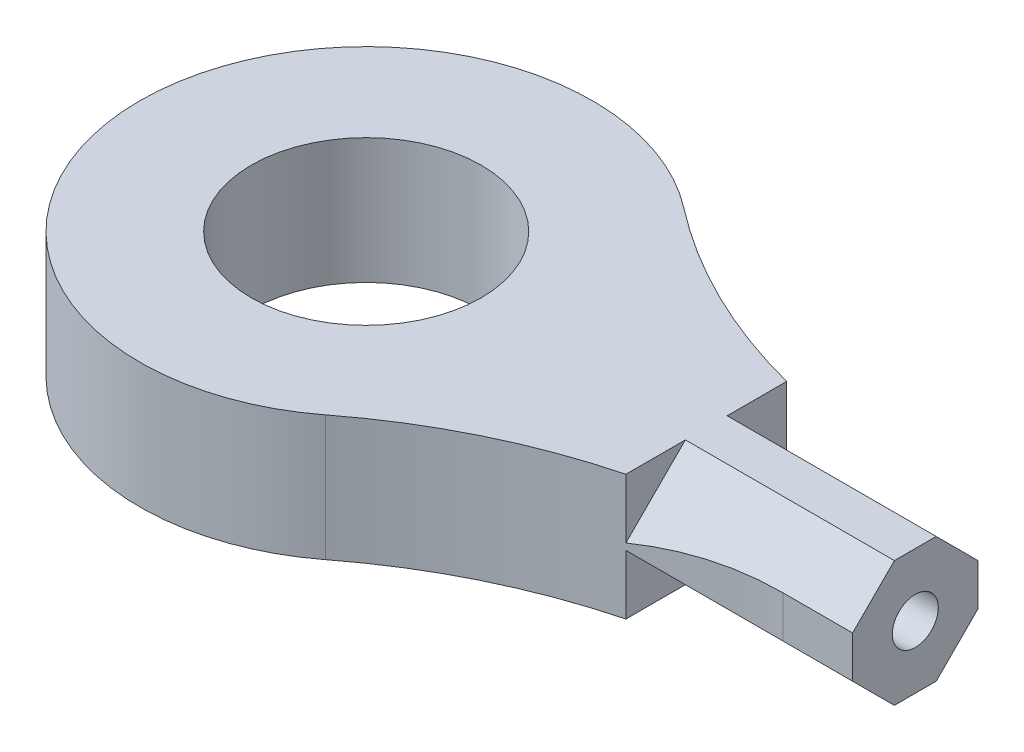
ISO-10303-21;
HEADER;
FILE_DESCRIPTION(('STEP AP214'),'2;1');
FILE_NAME('part.step','',(''),(''),'','','');
FILE_SCHEMA(('AUTOMOTIVE_DESIGN { 1 0 10303 214 1 1 1 1 }'));
ENDSEC;
DATA;
#1=APPLICATION_CONTEXT('core data for automotive mechanical design processes');
#2=APPLICATION_PROTOCOL_DEFINITION('international standard','automotive_design',2000,#1);
#3=PRODUCT_CONTEXT('',#1,'mechanical');
#4=PRODUCT('Part','Part','',(#3));
#5=PRODUCT_RELATED_PRODUCT_CATEGORY('part','',(#4));
#6=PRODUCT_DEFINITION_FORMATION('','',#4);
#7=PRODUCT_DEFINITION_CONTEXT('part definition',#1,'design');
#8=PRODUCT_DEFINITION('design','',#6,#7);
#9=PRODUCT_DEFINITION_SHAPE('','',#8);
#10=(LENGTH_UNIT() NAMED_UNIT(*) SI_UNIT(.MILLI.,.METRE.));
#11=(NAMED_UNIT(*) PLANE_ANGLE_UNIT() SI_UNIT($,.RADIAN.));
#12=(NAMED_UNIT(*) SI_UNIT($,.STERADIAN.) SOLID_ANGLE_UNIT());
#13=UNCERTAINTY_MEASURE_WITH_UNIT(LENGTH_MEASURE(1.E-05),#10,'distance_accuracy_value','');
#14=(GEOMETRIC_REPRESENTATION_CONTEXT(3) GLOBAL_UNCERTAINTY_ASSIGNED_CONTEXT((#13)) GLOBAL_UNIT_ASSIGNED_CONTEXT((#10,
#11,#12)) REPRESENTATION_CONTEXT('',''));
#15=CARTESIAN_POINT('',(0.,0.,0.));
#16=DIRECTION('',(0.,0.,1.));
#17=DIRECTION('',(1.,0.,0.));
#18=AXIS2_PLACEMENT_3D('',#15,#16,#17);
#19=CARTESIAN_POINT('',(34.4065764062628,9.,-44.5));
#20=DIRECTION('',(0.,1.,0.));
#21=DIRECTION('',(0.,0.,1.));
#22=AXIS2_PLACEMENT_3D('',#19,#20,#21);
#23=PLANE('',#22);
#24=DIRECTION('',(1.,0.,0.));
#25=VECTOR('',#24,1.);
#26=CARTESIAN_POINT('',(34.4065764062628,9.,-1.5));
#27=LINE('',#26,#25);
#28=CARTESIAN_POINT('',(24.4065764062628,9.,-1.5));
#29=VERTEX_POINT('',#28);
#30=CARTESIAN_POINT('',(39.4065764062628,9.,-1.5));
#31=VERTEX_POINT('',#30);
#32=EDGE_CURVE('E221',#29,#31,#27,.T.);
#33=ORIENTED_EDGE('',*,*,#32,.F.);
#34=DIRECTION('',(0.,0.,-1.));
#35=VECTOR('',#34,1.);
#36=CARTESIAN_POINT('',(24.4065764062628,9.,-44.5));
#37=LINE('',#36,#35);
#38=CARTESIAN_POINT('',(24.4065764062628,9.,-5.77016653792583));
#39=VERTEX_POINT('',#38);
#40=EDGE_CURVE('E209',#29,#39,#37,.T.);
#41=ORIENTED_EDGE('',*,*,#40,.T.);
#42=CARTESIAN_POINT('',(34.4065764062628,9.,-44.5));
#43=DIRECTION('',(0.,-1.,0.));
#44=DIRECTION('',(0.,0.,1.));
#45=AXIS2_PLACEMENT_3D('',#42,#43,#44);
#46=CIRCLE('',#45,40.);
#47=CARTESIAN_POINT('',(9.93967762847592,9.,-12.8555555555556));
#48=VERTEX_POINT('',#47);
#49=EDGE_CURVE('E218',#39,#48,#46,.T.);
#50=ORIENTED_EDGE('',*,*,#49,.T.);
#51=CARTESIAN_POINT('',(0.,9.,0.));
#52=DIRECTION('',(0.,1.,0.));
#53=DIRECTION('',(0.,0.,1.));
#54=AXIS2_PLACEMENT_3D('',#51,#52,#53);
#55=CIRCLE('',#54,16.25);
#56=CARTESIAN_POINT('',(9.93967762847592,9.,12.8555555555556));
#57=VERTEX_POINT('',#56);
#58=EDGE_CURVE('E225',#48,#57,#55,.T.);
#59=ORIENTED_EDGE('',*,*,#58,.T.);
#60=CARTESIAN_POINT('',(34.4065764062628,9.,44.5));
#61=DIRECTION('',(0.,-1.,0.));
#62=DIRECTION('',(0.,0.,-1.));
#63=AXIS2_PLACEMENT_3D('',#60,#61,#62);
#64=CIRCLE('',#63,40.);
#65=CARTESIAN_POINT('',(24.4065764062628,9.,5.77016653792583));
#66=VERTEX_POINT('',#65);
#67=EDGE_CURVE('E228',#57,#66,#64,.T.);
#68=ORIENTED_EDGE('',*,*,#67,.T.);
#69=DIRECTION('',(0.,0.,-1.));
#70=VECTOR('',#69,1.);
#71=CARTESIAN_POINT('',(24.4065764062628,9.,-44.5));
#72=LINE('',#71,#70);
#73=CARTESIAN_POINT('',(24.4065764062628,9.,1.5));
#74=VERTEX_POINT('',#73);
#75=EDGE_CURVE('E280',#66,#74,#72,.T.);
#76=ORIENTED_EDGE('',*,*,#75,.T.);
#77=DIRECTION('',(1.,0.,0.));
#78=VECTOR('',#77,1.);
#79=CARTESIAN_POINT('',(34.4065764062628,9.,1.49999999999999));
#80=LINE('',#79,#78);
#81=CARTESIAN_POINT('',(39.4065764062628,9.,1.5));
#82=VERTEX_POINT('',#81);
#83=EDGE_CURVE('E277',#74,#82,#80,.T.);
#84=ORIENTED_EDGE('',*,*,#83,.T.);
#85=DIRECTION('',(0.,0.,-1.));
#86=VECTOR('',#85,1.);
#87=CARTESIAN_POINT('',(39.4065764062628,9.,-4.5));
#88=LINE('',#87,#86);
#89=EDGE_CURVE('E238',#82,#31,#88,.T.);
#90=ORIENTED_EDGE('',*,*,#89,.T.);
#91=EDGE_LOOP('',(#33,#41,#50,#59,#68,#76,#84,#90));
#92=FACE_BOUND('',#91,.T.);
#93=CARTESIAN_POINT('',(0.,9.,0.));
#94=DIRECTION('',(0.,1.,0.));
#95=DIRECTION('',(0.,0.,1.));
#96=AXIS2_PLACEMENT_3D('',#93,#94,#95);
#97=CIRCLE('',#96,8.25);
#98=CARTESIAN_POINT('',(0.,9.,8.25));
#99=VERTEX_POINT('',#98);
#100=EDGE_CURVE('E243',#99,#99,#97,.T.);
#101=ORIENTED_EDGE('',*,*,#100,.F.);
#102=EDGE_LOOP('',(#101));
#103=FACE_BOUND('',#102,.T.);
#104=ADVANCED_FACE('F57',(#92,#103),#23,.T.);
#105=CARTESIAN_POINT('',(34.4065764062628,0.,-44.5));
#106=DIRECTION('',(0.,1.,0.));
#107=DIRECTION('',(0.,0.,1.));
#108=AXIS2_PLACEMENT_3D('',#105,#106,#107);
#109=PLANE('',#108);
#110=CARTESIAN_POINT('',(0.,0.,0.));
#111=DIRECTION('',(0.,1.,0.));
#112=DIRECTION('',(0.,0.,1.));
#113=AXIS2_PLACEMENT_3D('',#110,#111,#112);
#114=CIRCLE('',#113,8.25);
#115=CARTESIAN_POINT('',(0.,0.,8.25));
#116=VERTEX_POINT('',#115);
#117=EDGE_CURVE('E233',#116,#116,#114,.T.);
#118=ORIENTED_EDGE('',*,*,#117,.T.);
#119=EDGE_LOOP('',(#118));
#120=FACE_BOUND('',#119,.T.);
#121=DIRECTION('',(0.,0.,-1.));
#122=VECTOR('',#121,1.);
#123=CARTESIAN_POINT('',(39.4065764062628,0.,-4.5));
#124=LINE('',#123,#122);
#125=CARTESIAN_POINT('',(39.4065764062628,0.,1.5));
#126=VERTEX_POINT('',#125);
#127=CARTESIAN_POINT('',(39.4065764062628,0.,-1.5));
#128=VERTEX_POINT('',#127);
#129=EDGE_CURVE('E226',#126,#128,#124,.T.);
#130=ORIENTED_EDGE('',*,*,#129,.F.);
#131=DIRECTION('',(-1.,0.,0.));
#132=VECTOR('',#131,1.);
#133=CARTESIAN_POINT('',(34.4065764062628,0.,1.5));
#134=LINE('',#133,#132);
#135=CARTESIAN_POINT('',(24.4065764062628,0.,1.5));
#136=VERTEX_POINT('',#135);
#137=EDGE_CURVE('E72',#126,#136,#134,.T.);
#138=ORIENTED_EDGE('',*,*,#137,.T.);
#139=DIRECTION('',(0.,0.,-1.));
#140=VECTOR('',#139,1.);
#141=CARTESIAN_POINT('',(24.4065764062628,0.,-44.5));
#142=LINE('',#141,#140);
#143=CARTESIAN_POINT('',(24.4065764062628,0.,5.77016653792583));
#144=VERTEX_POINT('',#143);
#145=EDGE_CURVE('E338',#144,#136,#142,.T.);
#146=ORIENTED_EDGE('',*,*,#145,.F.);
#147=CARTESIAN_POINT('',(34.4065764062628,0.,44.5));
#148=DIRECTION('',(0.,-1.,0.));
#149=DIRECTION('',(0.,0.,-1.));
#150=AXIS2_PLACEMENT_3D('',#147,#148,#149);
#151=CIRCLE('',#150,40.);
#152=CARTESIAN_POINT('',(9.93967762847592,0.,12.8555555555556));
#153=VERTEX_POINT('',#152);
#154=EDGE_CURVE('E230',#153,#144,#151,.T.);
#155=ORIENTED_EDGE('',*,*,#154,.F.);
#156=CARTESIAN_POINT('',(0.,0.,0.));
#157=DIRECTION('',(0.,1.,0.));
#158=DIRECTION('',(0.,0.,1.));
#159=AXIS2_PLACEMENT_3D('',#156,#157,#158);
#160=CIRCLE('',#159,16.25);
#161=CARTESIAN_POINT('',(9.93967762847592,0.,-12.8555555555556));
#162=VERTEX_POINT('',#161);
#163=EDGE_CURVE('E242',#162,#153,#160,.T.);
#164=ORIENTED_EDGE('',*,*,#163,.F.);
#165=CARTESIAN_POINT('',(34.4065764062628,0.,-44.5));
#166=DIRECTION('',(0.,-1.,0.));
#167=DIRECTION('',(0.,0.,1.));
#168=AXIS2_PLACEMENT_3D('',#165,#166,#167);
#169=CIRCLE('',#168,40.);
#170=CARTESIAN_POINT('',(24.4065764062628,0.,-5.77016653792583));
#171=VERTEX_POINT('',#170);
#172=EDGE_CURVE('E240',#171,#162,#169,.T.);
#173=ORIENTED_EDGE('',*,*,#172,.F.);
#174=DIRECTION('',(0.,0.,-1.));
#175=VECTOR('',#174,1.);
#176=CARTESIAN_POINT('',(24.4065764062628,0.,-44.5));
#177=LINE('',#176,#175);
#178=CARTESIAN_POINT('',(24.4065764062628,0.,-1.5));
#179=VERTEX_POINT('',#178);
#180=EDGE_CURVE('E283',#179,#171,#177,.T.);
#181=ORIENTED_EDGE('',*,*,#180,.F.);
#182=DIRECTION('',(-1.,0.,0.));
#183=VECTOR('',#182,1.);
#184=CARTESIAN_POINT('',(34.4065764062628,0.,-1.5));
#185=LINE('',#184,#183);
#186=EDGE_CURVE('E261',#128,#179,#185,.T.);
#187=ORIENTED_EDGE('',*,*,#186,.F.);
#188=EDGE_LOOP('',(#130,#138,#146,#155,#164,#173,#181,#187));
#189=FACE_BOUND('',#188,.T.);
#190=ADVANCED_FACE('F296',(#120,#189),#109,.F.);
#191=CARTESIAN_POINT('',(34.4065764062628,9.,-44.5));
#192=DIRECTION('',(0.,-1.,0.));
#193=DIRECTION('',(0.,0.,-1.));
#194=AXIS2_PLACEMENT_3D('',#191,#192,#193);
#195=CYLINDRICAL_SURFACE('',#194,40.);
#196=DIRECTION('',(0.,-1.,0.));
#197=VECTOR('',#196,1.);
#198=CARTESIAN_POINT('',(24.4065764062628,9.,-5.77016653792583));
#199=LINE('',#198,#197);
#200=CARTESIAN_POINT('',(24.4065764062628,4.72983346207417,-5.77016653792583));
#201=VERTEX_POINT('',#200);
#202=EDGE_CURVE('E165',#201,#39,#199,.F.);
#203=ORIENTED_EDGE('',*,*,#202,.F.);
#204=CARTESIAN_POINT('',(34.4065764062628,-34.,-44.5));
#205=DIRECTION('',(0.,-0.707106781186548,0.707106781186547));
#206=DIRECTION('',(0.,-0.707106781186547,-0.707106781186548));
#207=AXIS2_PLACEMENT_3D('',#204,#205,#206);
#208=ELLIPSE('',#207,56.5685424949238,40.);
#209=CARTESIAN_POINT('',(34.4065764062628,6.,-4.5));
#210=VERTEX_POINT('',#209);
#211=EDGE_CURVE('E251',#201,#210,#208,.F.);
#212=ORIENTED_EDGE('',*,*,#211,.T.);
#213=DIRECTION('',(0.,-1.,0.));
#214=VECTOR('',#213,1.);
#215=CARTESIAN_POINT('',(34.4065764062628,9.,-4.5));
#216=LINE('',#215,#214);
#217=CARTESIAN_POINT('',(34.4065764062628,3.,-4.5));
#218=VERTEX_POINT('',#217);
#219=EDGE_CURVE('E185',#210,#218,#216,.T.);
#220=ORIENTED_EDGE('',*,*,#219,.T.);
#221=CARTESIAN_POINT('',(34.4065764062628,43.,-44.5));
#222=DIRECTION('',(0.,-0.707106781186547,-0.707106781186547));
#223=DIRECTION('',(0.,-0.707106781186548,0.707106781186548));
#224=AXIS2_PLACEMENT_3D('',#221,#222,#223);
#225=ELLIPSE('',#224,56.5685424949238,40.);
#226=CARTESIAN_POINT('',(24.4065764062628,4.27016653792583,-5.77016653792583));
#227=VERTEX_POINT('',#226);
#228=EDGE_CURVE('E250',#227,#218,#225,.F.);
#229=ORIENTED_EDGE('',*,*,#228,.F.);
#230=DIRECTION('',(0.,-1.,0.));
#231=VECTOR('',#230,1.);
#232=CARTESIAN_POINT('',(24.4065764062628,9.,-5.77016653792583));
#233=LINE('',#232,#231);
#234=EDGE_CURVE('E200',#171,#227,#233,.F.);
#235=ORIENTED_EDGE('',*,*,#234,.F.);
#236=ORIENTED_EDGE('',*,*,#172,.T.);
#237=DIRECTION('',(0.,-1.,0.));
#238=VECTOR('',#237,1.);
#239=CARTESIAN_POINT('',(9.93967762847592,9.,-12.8555555555556));
#240=LINE('',#239,#238);
#241=EDGE_CURVE('E191',#48,#162,#240,.T.);
#242=ORIENTED_EDGE('',*,*,#241,.F.);
#243=ORIENTED_EDGE('',*,*,#49,.F.);
#244=EDGE_LOOP('',(#203,#212,#220,#229,#235,#236,#242,#243));
#245=FACE_BOUND('',#244,.T.);
#246=ADVANCED_FACE('F59',(#245),#195,.F.);
#247=CARTESIAN_POINT('',(34.4065764062628,9.,44.5));
#248=DIRECTION('',(0.,-1.,0.));
#249=DIRECTION('',(0.,0.,-1.));
#250=AXIS2_PLACEMENT_3D('',#247,#248,#249);
#251=CYLINDRICAL_SURFACE('',#250,40.);
#252=DIRECTION('',(0.,-1.,0.));
#253=VECTOR('',#252,1.);
#254=CARTESIAN_POINT('',(24.4065764062628,9.,5.77016653792583));
#255=LINE('',#254,#253);
#256=CARTESIAN_POINT('',(24.4065764062628,4.27016653792583,5.77016653792583));
#257=VERTEX_POINT('',#256);
#258=EDGE_CURVE('E12',#257,#144,#255,.T.);
#259=ORIENTED_EDGE('',*,*,#258,.F.);
#260=CARTESIAN_POINT('',(34.4065764062628,43.,44.5));
#261=DIRECTION('',(0.,0.707106781186547,-0.707106781186547));
#262=DIRECTION('',(0.,-0.707106781186548,-0.707106781186548));
#263=AXIS2_PLACEMENT_3D('',#260,#261,#262);
#264=ELLIPSE('',#263,56.5685424949238,40.);
#265=CARTESIAN_POINT('',(34.4065764062628,3.,4.5));
#266=VERTEX_POINT('',#265);
#267=EDGE_CURVE('E174',#257,#266,#264,.F.);
#268=ORIENTED_EDGE('',*,*,#267,.T.);
#269=DIRECTION('',(0.,-1.,0.));
#270=VECTOR('',#269,1.);
#271=CARTESIAN_POINT('',(34.4065764062628,9.,4.5));
#272=LINE('',#271,#270);
#273=CARTESIAN_POINT('',(34.4065764062628,6.,4.5));
#274=VERTEX_POINT('',#273);
#275=EDGE_CURVE('E173',#274,#266,#272,.T.);
#276=ORIENTED_EDGE('',*,*,#275,.F.);
#277=CARTESIAN_POINT('',(34.4065764062628,-34.,44.5));
#278=DIRECTION('',(0.,0.707106781186548,0.707106781186547));
#279=DIRECTION('',(0.,-0.707106781186547,0.707106781186548));
#280=AXIS2_PLACEMENT_3D('',#277,#278,#279);
#281=ELLIPSE('',#280,56.5685424949238,40.);
#282=CARTESIAN_POINT('',(24.4065764062628,4.72983346207417,5.77016653792583));
#283=VERTEX_POINT('',#282);
#284=EDGE_CURVE('E275',#283,#274,#281,.F.);
#285=ORIENTED_EDGE('',*,*,#284,.F.);
#286=DIRECTION('',(0.,-1.,0.));
#287=VECTOR('',#286,1.);
#288=CARTESIAN_POINT('',(24.4065764062628,9.,5.77016653792583));
#289=LINE('',#288,#287);
#290=EDGE_CURVE('E198',#66,#283,#289,.T.);
#291=ORIENTED_EDGE('',*,*,#290,.F.);
#292=ORIENTED_EDGE('',*,*,#67,.F.);
#293=DIRECTION('',(0.,-1.,0.));
#294=VECTOR('',#293,1.);
#295=CARTESIAN_POINT('',(9.93967762847592,9.,12.8555555555556));
#296=LINE('',#295,#294);
#297=EDGE_CURVE('E183',#57,#153,#296,.T.);
#298=ORIENTED_EDGE('',*,*,#297,.T.);
#299=ORIENTED_EDGE('',*,*,#154,.T.);
#300=EDGE_LOOP('',(#259,#268,#276,#285,#291,#292,#298,#299));
#301=FACE_BOUND('',#300,.T.);
#302=ADVANCED_FACE('F326',(#301),#251,.F.);
#303=CARTESIAN_POINT('',(39.4065764062628,9.,4.5));
#304=DIRECTION('',(0.,0.,-1.));
#305=DIRECTION('',(-1.,0.,0.));
#306=AXIS2_PLACEMENT_3D('',#303,#304,#305);
#307=PLANE('',#306);
#308=ORIENTED_EDGE('',*,*,#275,.T.);
#309=DIRECTION('',(1.,0.,0.));
#310=VECTOR('',#309,1.);
#311=CARTESIAN_POINT('',(39.4065764062628,3.,4.5));
#312=LINE('',#311,#310);
#313=CARTESIAN_POINT('',(39.4065764062628,3.,4.5));
#314=VERTEX_POINT('',#313);
#315=EDGE_CURVE('E160',#266,#314,#312,.T.);
#316=ORIENTED_EDGE('',*,*,#315,.T.);
#317=DIRECTION('',(0.,-1.,0.));
#318=VECTOR('',#317,1.);
#319=CARTESIAN_POINT('',(39.4065764062628,9.,4.5));
#320=LINE('',#319,#318);
#321=CARTESIAN_POINT('',(39.4065764062628,6.,4.5));
#322=VERTEX_POINT('',#321);
#323=EDGE_CURVE('E171',#322,#314,#320,.T.);
#324=ORIENTED_EDGE('',*,*,#323,.F.);
#325=DIRECTION('',(1.,0.,0.));
#326=VECTOR('',#325,1.);
#327=CARTESIAN_POINT('',(39.4065764062628,6.,4.5));
#328=LINE('',#327,#326);
#329=EDGE_CURVE('E273',#274,#322,#328,.T.);
#330=ORIENTED_EDGE('',*,*,#329,.F.);
#331=EDGE_LOOP('',(#308,#316,#324,#330));
#332=FACE_BOUND('',#331,.T.);
#333=ADVANCED_FACE('F169',(#332),#307,.F.);
#334=CARTESIAN_POINT('',(39.4065764062628,9.,-4.5));
#335=DIRECTION('',(-1.,0.,0.));
#336=DIRECTION('',(0.,0.,1.));
#337=AXIS2_PLACEMENT_3D('',#334,#335,#336);
#338=PLANE('',#337);
#339=CARTESIAN_POINT('',(39.4065764062628,4.5,0.));
#340=DIRECTION('',(1.,0.,0.));
#341=DIRECTION('',(0.,0.,-1.));
#342=AXIS2_PLACEMENT_3D('',#339,#340,#341);
#343=CIRCLE('',#342,1.65);
#344=CARTESIAN_POINT('',(39.4065764062628,4.5,-1.65));
#345=VERTEX_POINT('',#344);
#346=EDGE_CURVE('E285',#345,#345,#343,.T.);
#347=ORIENTED_EDGE('',*,*,#346,.F.);
#348=EDGE_LOOP('',(#347));
#349=FACE_BOUND('',#348,.T.);
#350=ORIENTED_EDGE('',*,*,#323,.T.);
#351=DIRECTION('',(0.,-0.707106781186548,-0.707106781186548));
#352=VECTOR('',#351,1.);
#353=CARTESIAN_POINT('',(39.4065764062628,1.5,3.));
#354=LINE('',#353,#352);
#355=EDGE_CURVE('E65',#314,#126,#354,.T.);
#356=ORIENTED_EDGE('',*,*,#355,.T.);
#357=ORIENTED_EDGE('',*,*,#129,.T.);
#358=DIRECTION('',(0.,0.707106781186548,-0.707106781186548));
#359=VECTOR('',#358,1.);
#360=CARTESIAN_POINT('',(39.4065764062628,-0.75,-0.75));
#361=LINE('',#360,#359);
#362=CARTESIAN_POINT('',(39.4065764062628,3.,-4.5));
#363=VERTEX_POINT('',#362);
#364=EDGE_CURVE('E222',#128,#363,#361,.T.);
#365=ORIENTED_EDGE('',*,*,#364,.T.);
#366=DIRECTION('',(0.,-1.,0.));
#367=VECTOR('',#366,1.);
#368=CARTESIAN_POINT('',(39.4065764062628,9.,-4.5));
#369=LINE('',#368,#367);
#370=CARTESIAN_POINT('',(39.4065764062628,6.,-4.5));
#371=VERTEX_POINT('',#370);
#372=EDGE_CURVE('E181',#371,#363,#369,.T.);
#373=ORIENTED_EDGE('',*,*,#372,.F.);
#374=DIRECTION('',(0.,-0.707106781186547,-0.707106781186548));
#375=VECTOR('',#374,1.);
#376=CARTESIAN_POINT('',(39.4065764062628,5.25,-5.25));
#377=LINE('',#376,#375);
#378=EDGE_CURVE('E80',#31,#371,#377,.T.);
#379=ORIENTED_EDGE('',*,*,#378,.F.);
#380=ORIENTED_EDGE('',*,*,#89,.F.);
#381=DIRECTION('',(0.,0.707106781186547,-0.707106781186548));
#382=VECTOR('',#381,1.);
#383=CARTESIAN_POINT('',(39.4065764062628,12.,-1.5));
#384=LINE('',#383,#382);
#385=EDGE_CURVE('E180',#322,#82,#384,.T.);
#386=ORIENTED_EDGE('',*,*,#385,.F.);
#387=EDGE_LOOP('',(#350,#356,#357,#365,#373,#379,#380,#386));
#388=FACE_BOUND('',#387,.T.);
#389=ADVANCED_FACE('F178',(#349,#388),#338,.F.);
#390=CARTESIAN_POINT('',(39.4065764062628,9.,-4.5));
#391=DIRECTION('',(0.,0.,1.));
#392=DIRECTION('',(1.,0.,0.));
#393=AXIS2_PLACEMENT_3D('',#390,#391,#392);
#394=PLANE('',#393);
#395=ORIENTED_EDGE('',*,*,#219,.F.);
#396=DIRECTION('',(1.,0.,0.));
#397=VECTOR('',#396,1.);
#398=CARTESIAN_POINT('',(39.4065764062628,6.,-4.5));
#399=LINE('',#398,#397);
#400=EDGE_CURVE('E202',#210,#371,#399,.T.);
#401=ORIENTED_EDGE('',*,*,#400,.T.);
#402=ORIENTED_EDGE('',*,*,#372,.T.);
#403=DIRECTION('',(1.,0.,0.));
#404=VECTOR('',#403,1.);
#405=CARTESIAN_POINT('',(39.4065764062628,3.,-4.5));
#406=LINE('',#405,#404);
#407=EDGE_CURVE('E194',#218,#363,#406,.T.);
#408=ORIENTED_EDGE('',*,*,#407,.F.);
#409=EDGE_LOOP('',(#395,#401,#402,#408));
#410=FACE_BOUND('',#409,.T.);
#411=ADVANCED_FACE('F264',(#410),#394,.F.);
#412=CARTESIAN_POINT('',(0.,9.,0.));
#413=DIRECTION('',(0.,-1.,0.));
#414=DIRECTION('',(0.,0.,-1.));
#415=AXIS2_PLACEMENT_3D('',#412,#413,#414);
#416=CYLINDRICAL_SURFACE('',#415,16.25);
#417=ORIENTED_EDGE('',*,*,#163,.T.);
#418=ORIENTED_EDGE('',*,*,#297,.F.);
#419=ORIENTED_EDGE('',*,*,#58,.F.);
#420=ORIENTED_EDGE('',*,*,#241,.T.);
#421=EDGE_LOOP('',(#417,#418,#419,#420));
#422=FACE_BOUND('',#421,.T.);
#423=ADVANCED_FACE('F302',(#422),#416,.T.);
#424=CARTESIAN_POINT('',(0.,9.,0.));
#425=DIRECTION('',(0.,-1.,0.));
#426=DIRECTION('',(0.,0.,-1.));
#427=AXIS2_PLACEMENT_3D('',#424,#425,#426);
#428=CYLINDRICAL_SURFACE('',#427,8.25);
#429=ORIENTED_EDGE('',*,*,#100,.T.);
#430=EDGE_LOOP('',(#429));
#431=FACE_BOUND('',#430,.T.);
#432=ORIENTED_EDGE('',*,*,#117,.F.);
#433=EDGE_LOOP('',(#432));
#434=FACE_BOUND('',#433,.T.);
#435=ADVANCED_FACE('F299',(#431,#434),#428,.F.);
#436=CARTESIAN_POINT('',(28.4065764062628,4.5,0.));
#437=DIRECTION('',(1.,0.,0.));
#438=DIRECTION('',(0.,0.,-1.));
#439=AXIS2_PLACEMENT_3D('',#436,#437,#438);
#440=CONICAL_SURFACE('',#439,1.65,1.02974425867665);
#441=CARTESIAN_POINT('',(27.4151563848673,4.5,0.));
#442=VERTEX_POINT('',#441);
#443=VERTEX_LOOP('',#442);
#444=FACE_BOUND('',#443,.T.);
#445=CARTESIAN_POINT('',(28.4065764062628,4.5,0.));
#446=DIRECTION('',(1.,0.,0.));
#447=DIRECTION('',(0.,0.,-1.));
#448=AXIS2_PLACEMENT_3D('',#445,#446,#447);
#449=CIRCLE('',#448,1.65);
#450=CARTESIAN_POINT('',(28.4065764062628,4.5,-1.65));
#451=VERTEX_POINT('',#450);
#452=EDGE_CURVE('E288',#451,#451,#449,.T.);
#453=ORIENTED_EDGE('',*,*,#452,.T.);
#454=EDGE_LOOP('',(#453));
#455=FACE_BOUND('',#454,.T.);
#456=ADVANCED_FACE('F301',(#444,#455),#440,.F.);
#457=CARTESIAN_POINT('',(39.4065764062628,4.5,0.));
#458=DIRECTION('',(1.,0.,0.));
#459=DIRECTION('',(0.,0.,-1.));
#460=AXIS2_PLACEMENT_3D('',#457,#458,#459);
#461=CYLINDRICAL_SURFACE('',#460,1.65);
#462=ORIENTED_EDGE('',*,*,#452,.F.);
#463=EDGE_LOOP('',(#462));
#464=FACE_BOUND('',#463,.T.);
#465=ORIENTED_EDGE('',*,*,#346,.T.);
#466=EDGE_LOOP('',(#465));
#467=FACE_BOUND('',#466,.T.);
#468=ADVANCED_FACE('F308',(#464,#467),#461,.F.);
#469=CARTESIAN_POINT('',(24.4065764062628,0.,0.));
#470=DIRECTION('',(1.,0.,0.));
#471=DIRECTION('',(0.,0.,-1.));
#472=AXIS2_PLACEMENT_3D('',#469,#470,#471);
#473=PLANE('',#472);
#474=ORIENTED_EDGE('',*,*,#180,.T.);
#475=ORIENTED_EDGE('',*,*,#234,.T.);
#476=DIRECTION('',(0.,0.707106781186548,-0.707106781186548));
#477=VECTOR('',#476,1.);
#478=CARTESIAN_POINT('',(24.4065764062628,-0.75,-0.75));
#479=LINE('',#478,#477);
#480=EDGE_CURVE('E260',#179,#227,#479,.T.);
#481=ORIENTED_EDGE('',*,*,#480,.F.);
#482=EDGE_LOOP('',(#474,#475,#481));
#483=FACE_BOUND('',#482,.T.);
#484=ADVANCED_FACE('F361',(#483),#473,.T.);
#485=CARTESIAN_POINT('',(24.4065764062628,-0.75,-0.75));
#486=DIRECTION('',(0.,-0.707106781186547,-0.707106781186547));
#487=DIRECTION('',(0.,0.707106781186548,-0.707106781186548));
#488=AXIS2_PLACEMENT_3D('',#485,#486,#487);
#489=PLANE('',#488);
#490=ORIENTED_EDGE('',*,*,#186,.T.);
#491=ORIENTED_EDGE('',*,*,#480,.T.);
#492=ORIENTED_EDGE('',*,*,#228,.T.);
#493=ORIENTED_EDGE('',*,*,#407,.T.);
#494=ORIENTED_EDGE('',*,*,#364,.F.);
#495=EDGE_LOOP('',(#490,#491,#492,#493,#494));
#496=FACE_BOUND('',#495,.T.);
#497=ADVANCED_FACE('F256',(#496),#489,.T.);
#498=CARTESIAN_POINT('',(24.4065764062628,5.25,5.25));
#499=DIRECTION('',(0.,0.707106781186548,0.707106781186547));
#500=DIRECTION('',(0.,-0.707106781186547,0.707106781186548));
#501=AXIS2_PLACEMENT_3D('',#498,#499,#500);
#502=PLANE('',#501);
#503=DIRECTION('',(0.,-0.707106781186547,0.707106781186548));
#504=VECTOR('',#503,1.);
#505=CARTESIAN_POINT('',(24.4065764062628,5.25,5.25));
#506=LINE('',#505,#504);
#507=EDGE_CURVE('E262',#74,#283,#506,.T.);
#508=ORIENTED_EDGE('',*,*,#507,.T.);
#509=ORIENTED_EDGE('',*,*,#284,.T.);
#510=ORIENTED_EDGE('',*,*,#329,.T.);
#511=ORIENTED_EDGE('',*,*,#385,.T.);
#512=ORIENTED_EDGE('',*,*,#83,.F.);
#513=EDGE_LOOP('',(#508,#509,#510,#511,#512));
#514=FACE_BOUND('',#513,.T.);
#515=ADVANCED_FACE('F356',(#514),#502,.T.);
#516=CARTESIAN_POINT('',(24.4065764062628,0.,0.));
#517=DIRECTION('',(1.,0.,0.));
#518=DIRECTION('',(0.,0.,-1.));
#519=AXIS2_PLACEMENT_3D('',#516,#517,#518);
#520=PLANE('',#519);
#521=ORIENTED_EDGE('',*,*,#290,.T.);
#522=ORIENTED_EDGE('',*,*,#507,.F.);
#523=ORIENTED_EDGE('',*,*,#75,.F.);
#524=EDGE_LOOP('',(#521,#522,#523));
#525=FACE_BOUND('',#524,.T.);
#526=ADVANCED_FACE('F349',(#525),#520,.T.);
#527=CARTESIAN_POINT('',(24.4065764062628,5.25,-5.25));
#528=DIRECTION('',(0.,-0.707106781186548,0.707106781186547));
#529=DIRECTION('',(0.,-0.707106781186547,-0.707106781186548));
#530=AXIS2_PLACEMENT_3D('',#527,#528,#529);
#531=PLANE('',#530);
#532=ORIENTED_EDGE('',*,*,#32,.T.);
#533=ORIENTED_EDGE('',*,*,#378,.T.);
#534=ORIENTED_EDGE('',*,*,#400,.F.);
#535=ORIENTED_EDGE('',*,*,#211,.F.);
#536=DIRECTION('',(0.,-0.707106781186547,-0.707106781186548));
#537=VECTOR('',#536,1.);
#538=CARTESIAN_POINT('',(24.4065764062628,5.25,-5.25));
#539=LINE('',#538,#537);
#540=EDGE_CURVE('E211',#29,#201,#539,.T.);
#541=ORIENTED_EDGE('',*,*,#540,.F.);
#542=EDGE_LOOP('',(#532,#533,#534,#535,#541));
#543=FACE_BOUND('',#542,.T.);
#544=ADVANCED_FACE('F347',(#543),#531,.F.);
#545=CARTESIAN_POINT('',(24.4065764062628,0.,0.));
#546=DIRECTION('',(1.,0.,0.));
#547=DIRECTION('',(0.,0.,-1.));
#548=AXIS2_PLACEMENT_3D('',#545,#546,#547);
#549=PLANE('',#548);
#550=ORIENTED_EDGE('',*,*,#540,.T.);
#551=ORIENTED_EDGE('',*,*,#202,.T.);
#552=ORIENTED_EDGE('',*,*,#40,.F.);
#553=EDGE_LOOP('',(#550,#551,#552));
#554=FACE_BOUND('',#553,.T.);
#555=ADVANCED_FACE('F208',(#554),#549,.T.);
#556=CARTESIAN_POINT('',(24.4065764062628,0.,0.));
#557=DIRECTION('',(1.,0.,0.));
#558=DIRECTION('',(0.,0.,-1.));
#559=AXIS2_PLACEMENT_3D('',#556,#557,#558);
#560=PLANE('',#559);
#561=ORIENTED_EDGE('',*,*,#145,.T.);
#562=DIRECTION('',(0.,0.707106781186548,0.707106781186548));
#563=VECTOR('',#562,1.);
#564=CARTESIAN_POINT('',(24.4065764062628,-0.75,0.75));
#565=LINE('',#564,#563);
#566=EDGE_CURVE('E175',#136,#257,#565,.T.);
#567=ORIENTED_EDGE('',*,*,#566,.T.);
#568=ORIENTED_EDGE('',*,*,#258,.T.);
#569=EDGE_LOOP('',(#561,#567,#568));
#570=FACE_BOUND('',#569,.T.);
#571=ADVANCED_FACE('F337',(#570),#560,.T.);
#572=CARTESIAN_POINT('',(24.4065764062628,-0.75,0.75));
#573=DIRECTION('',(0.,0.707106781186547,-0.707106781186547));
#574=DIRECTION('',(0.,0.707106781186548,0.707106781186548));
#575=AXIS2_PLACEMENT_3D('',#572,#573,#574);
#576=PLANE('',#575);
#577=ORIENTED_EDGE('',*,*,#355,.F.);
#578=ORIENTED_EDGE('',*,*,#315,.F.);
#579=ORIENTED_EDGE('',*,*,#267,.F.);
#580=ORIENTED_EDGE('',*,*,#566,.F.);
#581=ORIENTED_EDGE('',*,*,#137,.F.);
#582=EDGE_LOOP('',(#577,#578,#579,#580,#581));
#583=FACE_BOUND('',#582,.T.);
#584=ADVANCED_FACE('F159',(#583),#576,.F.);
#585=CLOSED_SHELL('',(#104,#190,#246,#302,#333,#389,#411,#423,#435,#456,#468,#484,#497,#515,
#526,#544,#555,#571,#584));
#586=MANIFOLD_SOLID_BREP('B2',#585);
#587=ADVANCED_BREP_SHAPE_REPRESENTATION('',(#18,#586),#14);
#588=SHAPE_DEFINITION_REPRESENTATION(#9,#587);
ENDSEC;
END-ISO-10303-21;
